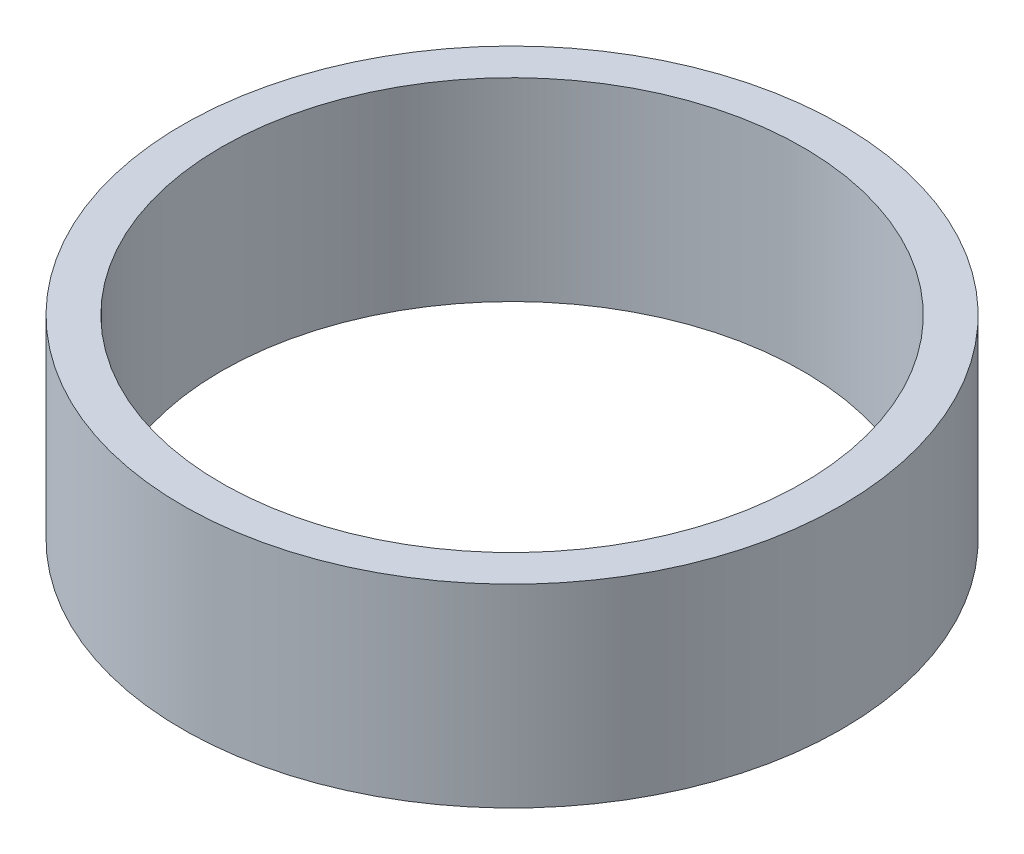
ISO-10303-21;
HEADER;
FILE_DESCRIPTION(('STEP AP214'),'2;1');
FILE_NAME('part.step','',(''),(''),'','','');
FILE_SCHEMA(('AUTOMOTIVE_DESIGN { 1 0 10303 214 1 1 1 1 }'));
ENDSEC;
DATA;
#1=APPLICATION_CONTEXT('core data for automotive mechanical design processes');
#2=APPLICATION_PROTOCOL_DEFINITION('international standard','automotive_design',2000,#1);
#3=PRODUCT_CONTEXT('',#1,'mechanical');
#4=PRODUCT('Part','Part','',(#3));
#5=PRODUCT_RELATED_PRODUCT_CATEGORY('part','',(#4));
#6=PRODUCT_DEFINITION_FORMATION('','',#4);
#7=PRODUCT_DEFINITION_CONTEXT('part definition',#1,'design');
#8=PRODUCT_DEFINITION('design','',#6,#7);
#9=PRODUCT_DEFINITION_SHAPE('','',#8);
#10=(LENGTH_UNIT() NAMED_UNIT(*) SI_UNIT(.MILLI.,.METRE.));
#11=(NAMED_UNIT(*) PLANE_ANGLE_UNIT() SI_UNIT($,.RADIAN.));
#12=(NAMED_UNIT(*) SI_UNIT($,.STERADIAN.) SOLID_ANGLE_UNIT());
#13=UNCERTAINTY_MEASURE_WITH_UNIT(LENGTH_MEASURE(1.E-05),#10,'distance_accuracy_value','');
#14=(GEOMETRIC_REPRESENTATION_CONTEXT(3) GLOBAL_UNCERTAINTY_ASSIGNED_CONTEXT((#13)) GLOBAL_UNIT_ASSIGNED_CONTEXT((#10,
#11,#12)) REPRESENTATION_CONTEXT('',''));
#15=CARTESIAN_POINT('',(0.,0.,0.));
#16=DIRECTION('',(0.,0.,1.));
#17=DIRECTION('',(1.,0.,0.));
#18=AXIS2_PLACEMENT_3D('',#15,#16,#17);
#19=CARTESIAN_POINT('',(0.,0.,0.));
#20=DIRECTION('',(0.,1.,0.));
#21=DIRECTION('',(1.,0.,0.));
#22=AXIS2_PLACEMENT_3D('',#19,#20,#21);
#23=PLANE('',#22);
#24=CARTESIAN_POINT('',(0.,0.,0.));
#25=DIRECTION('',(0.,-1.,0.));
#26=DIRECTION('',(1.,0.,0.));
#27=AXIS2_PLACEMENT_3D('',#24,#25,#26);
#28=CIRCLE('',#27,7.5);
#29=CARTESIAN_POINT('',(-7.5,0.,0.));
#30=VERTEX_POINT('',#29);
#31=EDGE_CURVE('E58',#30,#30,#28,.T.);
#32=ORIENTED_EDGE('',*,*,#31,.F.);
#33=EDGE_LOOP('',(#32));
#34=FACE_BOUND('',#33,.T.);
#35=CARTESIAN_POINT('',(0.,0.,0.));
#36=DIRECTION('',(0.,1.,0.));
#37=DIRECTION('',(-1.,0.,0.));
#38=AXIS2_PLACEMENT_3D('',#35,#36,#37);
#39=CIRCLE('',#38,8.5);
#40=CARTESIAN_POINT('',(8.5,0.,0.));
#41=VERTEX_POINT('',#40);
#42=EDGE_CURVE('E11',#41,#41,#39,.T.);
#43=ORIENTED_EDGE('',*,*,#42,.F.);
#44=EDGE_LOOP('',(#43));
#45=FACE_BOUND('',#44,.T.);
#46=ADVANCED_FACE('F17',(#34,#45),#23,.F.);
#47=CARTESIAN_POINT('',(0.,5.,0.));
#48=DIRECTION('',(0.,1.,0.));
#49=DIRECTION('',(1.,0.,0.));
#50=AXIS2_PLACEMENT_3D('',#47,#48,#49);
#51=PLANE('',#50);
#52=CARTESIAN_POINT('',(0.,5.,0.));
#53=DIRECTION('',(0.,-1.,0.));
#54=DIRECTION('',(1.,0.,0.));
#55=AXIS2_PLACEMENT_3D('',#52,#53,#54);
#56=CIRCLE('',#55,7.5);
#57=CARTESIAN_POINT('',(-7.5,5.,0.));
#58=VERTEX_POINT('',#57);
#59=EDGE_CURVE('E56',#58,#58,#56,.T.);
#60=ORIENTED_EDGE('',*,*,#59,.T.);
#61=EDGE_LOOP('',(#60));
#62=FACE_BOUND('',#61,.T.);
#63=CARTESIAN_POINT('',(0.,5.,0.));
#64=DIRECTION('',(0.,1.,0.));
#65=DIRECTION('',(-1.,0.,0.));
#66=AXIS2_PLACEMENT_3D('',#63,#64,#65);
#67=CIRCLE('',#66,8.5);
#68=CARTESIAN_POINT('',(8.5,5.,0.));
#69=VERTEX_POINT('',#68);
#70=EDGE_CURVE('E71',#69,#69,#67,.T.);
#71=ORIENTED_EDGE('',*,*,#70,.T.);
#72=EDGE_LOOP('',(#71));
#73=FACE_BOUND('',#72,.T.);
#74=ADVANCED_FACE('F62',(#62,#73),#51,.T.);
#75=CARTESIAN_POINT('',(0.,0.,0.));
#76=DIRECTION('',(0.,1.,0.));
#77=DIRECTION('',(-1.,0.,0.));
#78=AXIS2_PLACEMENT_3D('',#75,#76,#77);
#79=CYLINDRICAL_SURFACE('',#78,8.5);
#80=ORIENTED_EDGE('',*,*,#70,.F.);
#81=DIRECTION('',(0.,-1.,0.));
#82=VECTOR('',#81,1.);
#83=CARTESIAN_POINT('',(8.5,0.,0.));
#84=LINE('',#83,#82);
#85=EDGE_CURVE('E20',#69,#41,#84,.T.);
#86=ORIENTED_EDGE('',*,*,#85,.T.);
#87=ORIENTED_EDGE('',*,*,#42,.T.);
#88=ORIENTED_EDGE('',*,*,#85,.F.);
#89=EDGE_LOOP('',(#80,#86,#87,#88));
#90=FACE_BOUND('',#89,.T.);
#91=ADVANCED_FACE('F78',(#90),#79,.T.);
#92=CARTESIAN_POINT('',(0.,0.,0.));
#93=DIRECTION('',(0.,1.,0.));
#94=DIRECTION('',(1.,0.,0.));
#95=AXIS2_PLACEMENT_3D('',#92,#93,#94);
#96=CYLINDRICAL_SURFACE('',#95,7.5);
#97=ORIENTED_EDGE('',*,*,#59,.F.);
#98=DIRECTION('',(0.,-1.,0.));
#99=VECTOR('',#98,1.);
#100=CARTESIAN_POINT('',(-7.5,0.,0.));
#101=LINE('',#100,#99);
#102=EDGE_CURVE('E53',#58,#30,#101,.T.);
#103=ORIENTED_EDGE('',*,*,#102,.T.);
#104=ORIENTED_EDGE('',*,*,#31,.T.);
#105=ORIENTED_EDGE('',*,*,#102,.F.);
#106=EDGE_LOOP('',(#97,#103,#104,#105));
#107=FACE_BOUND('',#106,.T.);
#108=ADVANCED_FACE('F55',(#107),#96,.F.);
#109=CLOSED_SHELL('',(#46,#74,#91,#108));
#110=MANIFOLD_SOLID_BREP('B1',#109);
#111=ADVANCED_BREP_SHAPE_REPRESENTATION('',(#18,#110),#14);
#112=SHAPE_DEFINITION_REPRESENTATION(#9,#111);
ENDSEC;
END-ISO-10303-21;
